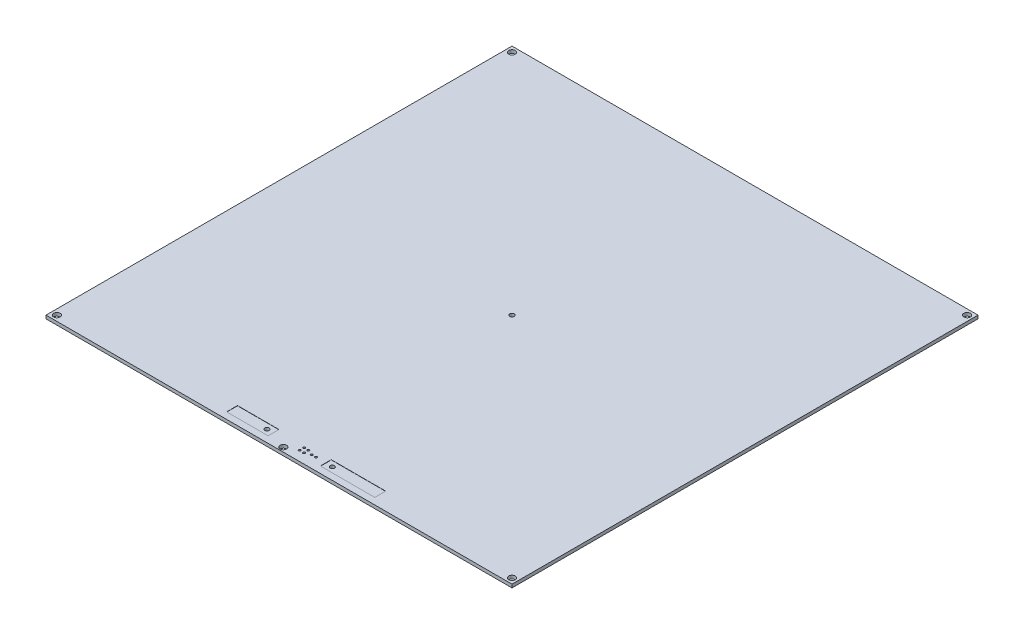
ISO-10303-21;
HEADER;
FILE_DESCRIPTION(('STEP AP214'),'2;1');
FILE_NAME('part.step','',(''),(''),'','','');
FILE_SCHEMA(('AUTOMOTIVE_DESIGN { 1 0 10303 214 1 1 1 1 }'));
ENDSEC;
DATA;
#1=APPLICATION_CONTEXT('core data for automotive mechanical design processes');
#2=APPLICATION_PROTOCOL_DEFINITION('international standard','automotive_design',2000,#1);
#3=PRODUCT_CONTEXT('',#1,'mechanical');
#4=PRODUCT('Part','Part','',(#3));
#5=PRODUCT_RELATED_PRODUCT_CATEGORY('part','',(#4));
#6=PRODUCT_DEFINITION_FORMATION('','',#4);
#7=PRODUCT_DEFINITION_CONTEXT('part definition',#1,'design');
#8=PRODUCT_DEFINITION('design','',#6,#7);
#9=PRODUCT_DEFINITION_SHAPE('','',#8);
#10=(LENGTH_UNIT() NAMED_UNIT(*) SI_UNIT(.MILLI.,.METRE.));
#11=(NAMED_UNIT(*) PLANE_ANGLE_UNIT() SI_UNIT($,.RADIAN.));
#12=(NAMED_UNIT(*) SI_UNIT($,.STERADIAN.) SOLID_ANGLE_UNIT());
#13=UNCERTAINTY_MEASURE_WITH_UNIT(LENGTH_MEASURE(1.E-05),#10,'distance_accuracy_value','');
#14=(GEOMETRIC_REPRESENTATION_CONTEXT(3) GLOBAL_UNCERTAINTY_ASSIGNED_CONTEXT((#13)) GLOBAL_UNIT_ASSIGNED_CONTEXT((#10,
#11,#12)) REPRESENTATION_CONTEXT('',''));
#15=CARTESIAN_POINT('',(0.,0.,0.));
#16=DIRECTION('',(0.,0.,1.));
#17=DIRECTION('',(1.,0.,0.));
#18=AXIS2_PLACEMENT_3D('',#15,#16,#17);
#19=CARTESIAN_POINT('',(19.,0.,101.5));
#20=DIRECTION('',(0.,1.,0.));
#21=DIRECTION('',(0.,0.,1.));
#22=AXIS2_PLACEMENT_3D('',#19,#20,#21);
#23=CYLINDRICAL_SURFACE('',#22,1.);
#24=CARTESIAN_POINT('',(19.,0.,101.5));
#25=DIRECTION('',(0.,1.,0.));
#26=DIRECTION('',(0.,0.,1.));
#27=AXIS2_PLACEMENT_3D('',#24,#25,#26);
#28=CIRCLE('',#27,1.);
#29=CARTESIAN_POINT('',(19.,0.,102.5));
#30=VERTEX_POINT('',#29);
#31=EDGE_CURVE('E234',#30,#30,#28,.T.);
#32=ORIENTED_EDGE('',*,*,#31,.F.);
#33=EDGE_LOOP('',(#32));
#34=FACE_BOUND('',#33,.T.);
#35=CARTESIAN_POINT('',(19.,1.4,101.5));
#36=DIRECTION('',(0.,1.,0.));
#37=DIRECTION('',(0.,0.,1.));
#38=AXIS2_PLACEMENT_3D('',#35,#36,#37);
#39=CIRCLE('',#38,1.);
#40=CARTESIAN_POINT('',(19.,1.4,102.5));
#41=VERTEX_POINT('',#40);
#42=EDGE_CURVE('E37',#41,#41,#39,.F.);
#43=ORIENTED_EDGE('',*,*,#42,.F.);
#44=EDGE_LOOP('',(#43));
#45=FACE_BOUND('',#44,.T.);
#46=ADVANCED_FACE('F33',(#34,#45),#23,.F.);
#47=CARTESIAN_POINT('',(-11.,0.,101.5));
#48=DIRECTION('',(0.,1.,0.));
#49=DIRECTION('',(0.,0.,1.));
#50=AXIS2_PLACEMENT_3D('',#47,#48,#49);
#51=CYLINDRICAL_SURFACE('',#50,1.);
#52=CARTESIAN_POINT('',(-11.,0.,101.5));
#53=DIRECTION('',(0.,1.,0.));
#54=DIRECTION('',(0.,0.,1.));
#55=AXIS2_PLACEMENT_3D('',#52,#53,#54);
#56=CIRCLE('',#55,1.);
#57=CARTESIAN_POINT('',(-11.,0.,102.5));
#58=VERTEX_POINT('',#57);
#59=EDGE_CURVE('E239',#58,#58,#56,.T.);
#60=ORIENTED_EDGE('',*,*,#59,.F.);
#61=EDGE_LOOP('',(#60));
#62=FACE_BOUND('',#61,.T.);
#63=CARTESIAN_POINT('',(-11.,1.4,101.5));
#64=DIRECTION('',(0.,1.,0.));
#65=DIRECTION('',(0.,0.,1.));
#66=AXIS2_PLACEMENT_3D('',#63,#64,#65);
#67=CIRCLE('',#66,1.);
#68=CARTESIAN_POINT('',(-11.,1.4,102.5));
#69=VERTEX_POINT('',#68);
#70=EDGE_CURVE('E188',#69,#69,#67,.F.);
#71=ORIENTED_EDGE('',*,*,#70,.F.);
#72=EDGE_LOOP('',(#71));
#73=FACE_BOUND('',#72,.T.);
#74=ADVANCED_FACE('F302',(#62,#73),#51,.F.);
#75=CARTESIAN_POINT('',(-107.,1.5,-107.));
#76=DIRECTION('',(1.,0.,0.));
#77=DIRECTION('',(0.,0.,-1.));
#78=AXIS2_PLACEMENT_3D('',#75,#76,#77);
#79=PLANE('',#78);
#80=DIRECTION('',(0.,0.,1.));
#81=VECTOR('',#80,1.);
#82=CARTESIAN_POINT('',(-107.,0.,-107.));
#83=LINE('',#82,#81);
#84=CARTESIAN_POINT('',(-107.,0.,-107.));
#85=VERTEX_POINT('',#84);
#86=CARTESIAN_POINT('',(-107.,0.,107.));
#87=VERTEX_POINT('',#86);
#88=EDGE_CURVE('E270',#85,#87,#83,.T.);
#89=ORIENTED_EDGE('',*,*,#88,.T.);
#90=DIRECTION('',(0.,-1.,0.));
#91=VECTOR('',#90,1.);
#92=CARTESIAN_POINT('',(-107.,1.5,107.));
#93=LINE('',#92,#91);
#94=CARTESIAN_POINT('',(-107.,1.5,107.));
#95=VERTEX_POINT('',#94);
#96=EDGE_CURVE('E11',#95,#87,#93,.T.);
#97=ORIENTED_EDGE('',*,*,#96,.F.);
#98=DIRECTION('',(0.,0.,1.));
#99=VECTOR('',#98,1.);
#100=CARTESIAN_POINT('',(-107.,1.5,-107.));
#101=LINE('',#100,#99);
#102=CARTESIAN_POINT('',(-107.,1.5,-107.));
#103=VERTEX_POINT('',#102);
#104=EDGE_CURVE('E273',#103,#95,#101,.T.);
#105=ORIENTED_EDGE('',*,*,#104,.F.);
#106=DIRECTION('',(0.,-1.,0.));
#107=VECTOR('',#106,1.);
#108=CARTESIAN_POINT('',(-107.,1.5,-107.));
#109=LINE('',#108,#107);
#110=EDGE_CURVE('E283',#103,#85,#109,.T.);
#111=ORIENTED_EDGE('',*,*,#110,.T.);
#112=EDGE_LOOP('',(#89,#97,#105,#111));
#113=FACE_BOUND('',#112,.T.);
#114=ADVANCED_FACE('F35',(#113),#79,.F.);
#115=CARTESIAN_POINT('',(107.,1.5,107.));
#116=DIRECTION('',(0.,0.,-1.));
#117=DIRECTION('',(-1.,0.,0.));
#118=AXIS2_PLACEMENT_3D('',#115,#116,#117);
#119=PLANE('',#118);
#120=DIRECTION('',(1.,0.,0.));
#121=VECTOR('',#120,1.);
#122=CARTESIAN_POINT('',(107.,0.,107.));
#123=LINE('',#122,#121);
#124=CARTESIAN_POINT('',(107.,0.,107.));
#125=VERTEX_POINT('',#124);
#126=EDGE_CURVE('E286',#87,#125,#123,.T.);
#127=ORIENTED_EDGE('',*,*,#126,.T.);
#128=DIRECTION('',(0.,-1.,0.));
#129=VECTOR('',#128,1.);
#130=CARTESIAN_POINT('',(107.,1.5,107.));
#131=LINE('',#130,#129);
#132=CARTESIAN_POINT('',(107.,1.5,107.));
#133=VERTEX_POINT('',#132);
#134=EDGE_CURVE('E42',#133,#125,#131,.T.);
#135=ORIENTED_EDGE('',*,*,#134,.F.);
#136=DIRECTION('',(1.,0.,0.));
#137=VECTOR('',#136,1.);
#138=CARTESIAN_POINT('',(107.,1.5,107.));
#139=LINE('',#138,#137);
#140=EDGE_CURVE('E276',#95,#133,#139,.T.);
#141=ORIENTED_EDGE('',*,*,#140,.F.);
#142=ORIENTED_EDGE('',*,*,#96,.T.);
#143=EDGE_LOOP('',(#127,#135,#141,#142));
#144=FACE_BOUND('',#143,.T.);
#145=ADVANCED_FACE('F310',(#144),#119,.F.);
#146=CARTESIAN_POINT('',(107.,1.5,-107.));
#147=DIRECTION('',(-1.,0.,0.));
#148=DIRECTION('',(0.,0.,1.));
#149=AXIS2_PLACEMENT_3D('',#146,#147,#148);
#150=PLANE('',#149);
#151=DIRECTION('',(0.,0.,-1.));
#152=VECTOR('',#151,1.);
#153=CARTESIAN_POINT('',(107.,0.,-107.));
#154=LINE('',#153,#152);
#155=CARTESIAN_POINT('',(107.,0.,-107.));
#156=VERTEX_POINT('',#155);
#157=EDGE_CURVE('E288',#125,#156,#154,.T.);
#158=ORIENTED_EDGE('',*,*,#157,.T.);
#159=DIRECTION('',(0.,-1.,0.));
#160=VECTOR('',#159,1.);
#161=CARTESIAN_POINT('',(107.,1.5,-107.));
#162=LINE('',#161,#160);
#163=CARTESIAN_POINT('',(107.,1.5,-107.));
#164=VERTEX_POINT('',#163);
#165=EDGE_CURVE('E293',#164,#156,#162,.T.);
#166=ORIENTED_EDGE('',*,*,#165,.F.);
#167=DIRECTION('',(0.,0.,-1.));
#168=VECTOR('',#167,1.);
#169=CARTESIAN_POINT('',(107.,1.5,-107.));
#170=LINE('',#169,#168);
#171=EDGE_CURVE('E279',#133,#164,#170,.T.);
#172=ORIENTED_EDGE('',*,*,#171,.F.);
#173=ORIENTED_EDGE('',*,*,#134,.T.);
#174=EDGE_LOOP('',(#158,#166,#172,#173));
#175=FACE_BOUND('',#174,.T.);
#176=ADVANCED_FACE('F349',(#175),#150,.F.);
#177=CARTESIAN_POINT('',(107.,1.5,-107.));
#178=DIRECTION('',(0.,0.,1.));
#179=DIRECTION('',(1.,0.,0.));
#180=AXIS2_PLACEMENT_3D('',#177,#178,#179);
#181=PLANE('',#180);
#182=DIRECTION('',(-1.,0.,0.));
#183=VECTOR('',#182,1.);
#184=CARTESIAN_POINT('',(107.,0.,-107.));
#185=LINE('',#184,#183);
#186=EDGE_CURVE('E277',#156,#85,#185,.T.);
#187=ORIENTED_EDGE('',*,*,#186,.T.);
#188=ORIENTED_EDGE('',*,*,#110,.F.);
#189=DIRECTION('',(-1.,0.,0.));
#190=VECTOR('',#189,1.);
#191=CARTESIAN_POINT('',(107.,1.5,-107.));
#192=LINE('',#191,#190);
#193=EDGE_CURVE('E281',#164,#103,#192,.T.);
#194=ORIENTED_EDGE('',*,*,#193,.F.);
#195=ORIENTED_EDGE('',*,*,#165,.T.);
#196=EDGE_LOOP('',(#187,#188,#194,#195));
#197=FACE_BOUND('',#196,.T.);
#198=ADVANCED_FACE('F342',(#197),#181,.F.);
#199=CARTESIAN_POINT('',(-107.,1.5,107.));
#200=DIRECTION('',(0.,-1.,0.));
#201=DIRECTION('',(0.,0.,-1.));
#202=AXIS2_PLACEMENT_3D('',#199,#200,#201);
#203=PLANE('',#202);
#204=DIRECTION('',(1.,0.,0.));
#205=VECTOR('',#204,1.);
#206=CARTESIAN_POINT('',(16.,1.5,104.));
#207=LINE('',#206,#205);
#208=CARTESIAN_POINT('',(16.,1.5,104.));
#209=VERTEX_POINT('',#208);
#210=CARTESIAN_POINT('',(41.,1.5,104.));
#211=VERTEX_POINT('',#210);
#212=EDGE_CURVE('E154',#209,#211,#207,.T.);
#213=ORIENTED_EDGE('',*,*,#212,.F.);
#214=DIRECTION('',(0.,0.,1.));
#215=VECTOR('',#214,1.);
#216=CARTESIAN_POINT('',(16.,1.5,99.));
#217=LINE('',#216,#215);
#218=CARTESIAN_POINT('',(16.,1.5,99.));
#219=VERTEX_POINT('',#218);
#220=EDGE_CURVE('E50',#219,#209,#217,.T.);
#221=ORIENTED_EDGE('',*,*,#220,.F.);
#222=DIRECTION('',(-1.,0.,0.));
#223=VECTOR('',#222,1.);
#224=CARTESIAN_POINT('',(16.,1.5,99.));
#225=LINE('',#224,#223);
#226=CARTESIAN_POINT('',(41.,1.5,99.));
#227=VERTEX_POINT('',#226);
#228=EDGE_CURVE('E145',#227,#219,#225,.T.);
#229=ORIENTED_EDGE('',*,*,#228,.F.);
#230=DIRECTION('',(0.,0.,-1.));
#231=VECTOR('',#230,1.);
#232=CARTESIAN_POINT('',(41.,1.5,99.));
#233=LINE('',#232,#231);
#234=EDGE_CURVE('E148',#211,#227,#233,.T.);
#235=ORIENTED_EDGE('',*,*,#234,.F.);
#236=EDGE_LOOP('',(#213,#221,#229,#235));
#237=FACE_BOUND('',#236,.T.);
#238=DIRECTION('',(1.,0.,0.));
#239=VECTOR('',#238,1.);
#240=CARTESIAN_POINT('',(-27.0506494979006,1.5,104.));
#241=LINE('',#240,#239);
#242=CARTESIAN_POINT('',(-27.0506494979006,1.5,104.));
#243=VERTEX_POINT('',#242);
#244=CARTESIAN_POINT('',(-8.,1.5,104.));
#245=VERTEX_POINT('',#244);
#246=EDGE_CURVE('E178',#243,#245,#241,.T.);
#247=ORIENTED_EDGE('',*,*,#246,.F.);
#248=DIRECTION('',(0.,0.,1.));
#249=VECTOR('',#248,1.);
#250=CARTESIAN_POINT('',(-27.0506494979006,1.5,99.));
#251=LINE('',#250,#249);
#252=CARTESIAN_POINT('',(-27.0506494979006,1.5,99.));
#253=VERTEX_POINT('',#252);
#254=EDGE_CURVE('E58',#253,#243,#251,.T.);
#255=ORIENTED_EDGE('',*,*,#254,.F.);
#256=DIRECTION('',(-1.,0.,0.));
#257=VECTOR('',#256,1.);
#258=CARTESIAN_POINT('',(-27.0506494979006,1.5,99.));
#259=LINE('',#258,#257);
#260=CARTESIAN_POINT('',(-8.,1.5,99.));
#261=VERTEX_POINT('',#260);
#262=EDGE_CURVE('E167',#261,#253,#259,.T.);
#263=ORIENTED_EDGE('',*,*,#262,.F.);
#264=DIRECTION('',(0.,0.,-1.));
#265=VECTOR('',#264,1.);
#266=CARTESIAN_POINT('',(-8.,1.5,99.));
#267=LINE('',#266,#265);
#268=EDGE_CURVE('E181',#245,#261,#267,.T.);
#269=ORIENTED_EDGE('',*,*,#268,.F.);
#270=EDGE_LOOP('',(#247,#255,#263,#269));
#271=FACE_BOUND('',#270,.T.);
#272=CARTESIAN_POINT('',(0.,1.5,0.));
#273=DIRECTION('',(0.,1.,0.));
#274=DIRECTION('',(0.,0.,1.));
#275=AXIS2_PLACEMENT_3D('',#272,#273,#274);
#276=CIRCLE('',#275,1.05);
#277=CARTESIAN_POINT('',(0.,1.5,1.05));
#278=VERTEX_POINT('',#277);
#279=EDGE_CURVE('E198',#278,#278,#276,.T.);
#280=ORIENTED_EDGE('',*,*,#279,.F.);
#281=EDGE_LOOP('',(#280));
#282=FACE_BOUND('',#281,.T.);
#283=CARTESIAN_POINT('',(11.5,1.5,101.5));
#284=DIRECTION('',(0.,1.,0.));
#285=DIRECTION('',(0.,0.,1.));
#286=AXIS2_PLACEMENT_3D('',#283,#284,#285);
#287=CIRCLE('',#286,0.500000000000001);
#288=CARTESIAN_POINT('',(11.5,1.5,102.));
#289=VERTEX_POINT('',#288);
#290=EDGE_CURVE('E197',#289,#289,#287,.T.);
#291=ORIENTED_EDGE('',*,*,#290,.F.);
#292=EDGE_LOOP('',(#291));
#293=FACE_BOUND('',#292,.T.);
#294=CARTESIAN_POINT('',(9.5,1.5,101.5));
#295=DIRECTION('',(0.,1.,0.));
#296=DIRECTION('',(0.,0.,1.));
#297=AXIS2_PLACEMENT_3D('',#294,#295,#296);
#298=CIRCLE('',#297,0.500000000000001);
#299=CARTESIAN_POINT('',(9.5,1.5,102.));
#300=VERTEX_POINT('',#299);
#301=EDGE_CURVE('E204',#300,#300,#298,.T.);
#302=ORIENTED_EDGE('',*,*,#301,.F.);
#303=EDGE_LOOP('',(#302));
#304=FACE_BOUND('',#303,.T.);
#305=CARTESIAN_POINT('',(7.,1.5,102.5));
#306=DIRECTION('',(0.,1.,0.));
#307=DIRECTION('',(0.,0.,1.));
#308=AXIS2_PLACEMENT_3D('',#305,#306,#307);
#309=CIRCLE('',#308,0.500000000000001);
#310=CARTESIAN_POINT('',(7.,1.5,103.));
#311=VERTEX_POINT('',#310);
#312=EDGE_CURVE('E210',#311,#311,#309,.T.);
#313=ORIENTED_EDGE('',*,*,#312,.F.);
#314=EDGE_LOOP('',(#313));
#315=FACE_BOUND('',#314,.T.);
#316=CARTESIAN_POINT('',(7.,1.5,100.5));
#317=DIRECTION('',(0.,1.,0.));
#318=DIRECTION('',(0.,0.,1.));
#319=AXIS2_PLACEMENT_3D('',#316,#317,#318);
#320=CIRCLE('',#319,0.500000000000001);
#321=CARTESIAN_POINT('',(7.,1.5,101.));
#322=VERTEX_POINT('',#321);
#323=EDGE_CURVE('E216',#322,#322,#320,.T.);
#324=ORIENTED_EDGE('',*,*,#323,.F.);
#325=EDGE_LOOP('',(#324));
#326=FACE_BOUND('',#325,.T.);
#327=CARTESIAN_POINT('',(5.,1.5,102.5));
#328=DIRECTION('',(0.,1.,0.));
#329=DIRECTION('',(0.,0.,1.));
#330=AXIS2_PLACEMENT_3D('',#327,#328,#329);
#331=CIRCLE('',#330,0.5);
#332=CARTESIAN_POINT('',(5.,1.5,103.));
#333=VERTEX_POINT('',#332);
#334=EDGE_CURVE('E222',#333,#333,#331,.T.);
#335=ORIENTED_EDGE('',*,*,#334,.F.);
#336=EDGE_LOOP('',(#335));
#337=FACE_BOUND('',#336,.T.);
#338=CARTESIAN_POINT('',(5.,1.5,100.5));
#339=DIRECTION('',(0.,1.,0.));
#340=DIRECTION('',(0.,0.,1.));
#341=AXIS2_PLACEMENT_3D('',#338,#339,#340);
#342=CIRCLE('',#341,0.500000000000001);
#343=CARTESIAN_POINT('',(5.,1.5,101.));
#344=VERTEX_POINT('',#343);
#345=EDGE_CURVE('E228',#344,#344,#342,.T.);
#346=ORIENTED_EDGE('',*,*,#345,.F.);
#347=EDGE_LOOP('',(#346));
#348=FACE_BOUND('',#347,.T.);
#349=CARTESIAN_POINT('',(0.,1.5,105.));
#350=DIRECTION('',(0.,1.,0.));
#351=DIRECTION('',(0.,0.,1.));
#352=AXIS2_PLACEMENT_3D('',#349,#350,#351);
#353=CIRCLE('',#352,1.5);
#354=CARTESIAN_POINT('',(0.,1.5,106.5));
#355=VERTEX_POINT('',#354);
#356=EDGE_CURVE('E242',#355,#355,#353,.T.);
#357=ORIENTED_EDGE('',*,*,#356,.F.);
#358=EDGE_LOOP('',(#357));
#359=FACE_BOUND('',#358,.T.);
#360=CARTESIAN_POINT('',(104.5,1.5,104.5));
#361=DIRECTION('',(0.,1.,0.));
#362=DIRECTION('',(0.,0.,-1.));
#363=AXIS2_PLACEMENT_3D('',#360,#361,#362);
#364=CIRCLE('',#363,1.5);
#365=CARTESIAN_POINT('',(104.5,1.5,103.));
#366=VERTEX_POINT('',#365);
#367=EDGE_CURVE('E246',#366,#366,#364,.T.);
#368=ORIENTED_EDGE('',*,*,#367,.F.);
#369=EDGE_LOOP('',(#368));
#370=FACE_BOUND('',#369,.T.);
#371=CARTESIAN_POINT('',(104.5,1.5,-104.5));
#372=DIRECTION('',(0.,-1.,0.));
#373=DIRECTION('',(0.,0.,1.));
#374=AXIS2_PLACEMENT_3D('',#371,#372,#373);
#375=CIRCLE('',#374,1.5);
#376=CARTESIAN_POINT('',(104.5,1.5,-103.));
#377=VERTEX_POINT('',#376);
#378=EDGE_CURVE('E252',#377,#377,#375,.T.);
#379=ORIENTED_EDGE('',*,*,#378,.T.);
#380=EDGE_LOOP('',(#379));
#381=FACE_BOUND('',#380,.T.);
#382=CARTESIAN_POINT('',(-104.5,1.5,104.5));
#383=DIRECTION('',(0.,-1.,0.));
#384=DIRECTION('',(0.,0.,-1.));
#385=AXIS2_PLACEMENT_3D('',#382,#383,#384);
#386=CIRCLE('',#385,1.5);
#387=CARTESIAN_POINT('',(-104.5,1.5,103.));
#388=VERTEX_POINT('',#387);
#389=EDGE_CURVE('E258',#388,#388,#386,.T.);
#390=ORIENTED_EDGE('',*,*,#389,.T.);
#391=EDGE_LOOP('',(#390));
#392=FACE_BOUND('',#391,.T.);
#393=CARTESIAN_POINT('',(-104.5,1.5,-104.5));
#394=DIRECTION('',(0.,1.,0.));
#395=DIRECTION('',(0.,0.,1.));
#396=AXIS2_PLACEMENT_3D('',#393,#394,#395);
#397=CIRCLE('',#396,1.5);
#398=CARTESIAN_POINT('',(-104.5,1.5,-103.));
#399=VERTEX_POINT('',#398);
#400=EDGE_CURVE('E264',#399,#399,#397,.T.);
#401=ORIENTED_EDGE('',*,*,#400,.F.);
#402=EDGE_LOOP('',(#401));
#403=FACE_BOUND('',#402,.T.);
#404=ORIENTED_EDGE('',*,*,#104,.T.);
#405=ORIENTED_EDGE('',*,*,#140,.T.);
#406=ORIENTED_EDGE('',*,*,#171,.T.);
#407=ORIENTED_EDGE('',*,*,#193,.T.);
#408=EDGE_LOOP('',(#404,#405,#406,#407));
#409=FACE_BOUND('',#408,.T.);
#410=ADVANCED_FACE('F339',(#237,#271,#282,#293,#304,#315,#326,#337,#348,#359,#370,#381,#392,
#403,#409),#203,.F.);
#411=CARTESIAN_POINT('',(-107.,0.,107.));
#412=DIRECTION('',(0.,-1.,0.));
#413=DIRECTION('',(0.,0.,-1.));
#414=AXIS2_PLACEMENT_3D('',#411,#412,#413);
#415=PLANE('',#414);
#416=CARTESIAN_POINT('',(0.,0.,0.));
#417=DIRECTION('',(0.,1.,0.));
#418=DIRECTION('',(0.,0.,1.));
#419=AXIS2_PLACEMENT_3D('',#416,#417,#418);
#420=CIRCLE('',#419,1.05);
#421=CARTESIAN_POINT('',(0.,0.,1.05));
#422=VERTEX_POINT('',#421);
#423=EDGE_CURVE('E194',#422,#422,#420,.T.);
#424=ORIENTED_EDGE('',*,*,#423,.T.);
#425=EDGE_LOOP('',(#424));
#426=FACE_BOUND('',#425,.T.);
#427=CARTESIAN_POINT('',(11.5,0.,101.5));
#428=DIRECTION('',(0.,1.,0.));
#429=DIRECTION('',(0.,0.,1.));
#430=AXIS2_PLACEMENT_3D('',#427,#428,#429);
#431=CIRCLE('',#430,0.500000000000001);
#432=CARTESIAN_POINT('',(11.5,0.,102.));
#433=VERTEX_POINT('',#432);
#434=EDGE_CURVE('E201',#433,#433,#431,.T.);
#435=ORIENTED_EDGE('',*,*,#434,.T.);
#436=EDGE_LOOP('',(#435));
#437=FACE_BOUND('',#436,.T.);
#438=CARTESIAN_POINT('',(9.5,0.,101.5));
#439=DIRECTION('',(0.,1.,0.));
#440=DIRECTION('',(0.,0.,1.));
#441=AXIS2_PLACEMENT_3D('',#438,#439,#440);
#442=CIRCLE('',#441,0.500000000000001);
#443=CARTESIAN_POINT('',(9.5,0.,102.));
#444=VERTEX_POINT('',#443);
#445=EDGE_CURVE('E207',#444,#444,#442,.T.);
#446=ORIENTED_EDGE('',*,*,#445,.T.);
#447=EDGE_LOOP('',(#446));
#448=FACE_BOUND('',#447,.T.);
#449=CARTESIAN_POINT('',(7.,0.,102.5));
#450=DIRECTION('',(0.,1.,0.));
#451=DIRECTION('',(0.,0.,1.));
#452=AXIS2_PLACEMENT_3D('',#449,#450,#451);
#453=CIRCLE('',#452,0.500000000000001);
#454=CARTESIAN_POINT('',(7.,0.,103.));
#455=VERTEX_POINT('',#454);
#456=EDGE_CURVE('E213',#455,#455,#453,.T.);
#457=ORIENTED_EDGE('',*,*,#456,.T.);
#458=EDGE_LOOP('',(#457));
#459=FACE_BOUND('',#458,.T.);
#460=CARTESIAN_POINT('',(7.,0.,100.5));
#461=DIRECTION('',(0.,1.,0.));
#462=DIRECTION('',(0.,0.,1.));
#463=AXIS2_PLACEMENT_3D('',#460,#461,#462);
#464=CIRCLE('',#463,0.500000000000001);
#465=CARTESIAN_POINT('',(7.,0.,101.));
#466=VERTEX_POINT('',#465);
#467=EDGE_CURVE('E219',#466,#466,#464,.T.);
#468=ORIENTED_EDGE('',*,*,#467,.T.);
#469=EDGE_LOOP('',(#468));
#470=FACE_BOUND('',#469,.T.);
#471=CARTESIAN_POINT('',(5.,0.,102.5));
#472=DIRECTION('',(0.,1.,0.));
#473=DIRECTION('',(0.,0.,1.));
#474=AXIS2_PLACEMENT_3D('',#471,#472,#473);
#475=CIRCLE('',#474,0.5);
#476=CARTESIAN_POINT('',(5.,0.,103.));
#477=VERTEX_POINT('',#476);
#478=EDGE_CURVE('E225',#477,#477,#475,.T.);
#479=ORIENTED_EDGE('',*,*,#478,.T.);
#480=EDGE_LOOP('',(#479));
#481=FACE_BOUND('',#480,.T.);
#482=CARTESIAN_POINT('',(5.,0.,100.5));
#483=DIRECTION('',(0.,1.,0.));
#484=DIRECTION('',(0.,0.,1.));
#485=AXIS2_PLACEMENT_3D('',#482,#483,#484);
#486=CIRCLE('',#485,0.500000000000001);
#487=CARTESIAN_POINT('',(5.,0.,101.));
#488=VERTEX_POINT('',#487);
#489=EDGE_CURVE('E231',#488,#488,#486,.T.);
#490=ORIENTED_EDGE('',*,*,#489,.T.);
#491=EDGE_LOOP('',(#490));
#492=FACE_BOUND('',#491,.T.);
#493=ORIENTED_EDGE('',*,*,#31,.T.);
#494=EDGE_LOOP('',(#493));
#495=FACE_BOUND('',#494,.T.);
#496=ORIENTED_EDGE('',*,*,#59,.T.);
#497=EDGE_LOOP('',(#496));
#498=FACE_BOUND('',#497,.T.);
#499=CARTESIAN_POINT('',(0.,0.,105.));
#500=DIRECTION('',(0.,1.,0.));
#501=DIRECTION('',(0.,0.,1.));
#502=AXIS2_PLACEMENT_3D('',#499,#500,#501);
#503=CIRCLE('',#502,1.5);
#504=CARTESIAN_POINT('',(0.,0.,106.5));
#505=VERTEX_POINT('',#504);
#506=EDGE_CURVE('E243',#505,#505,#503,.T.);
#507=ORIENTED_EDGE('',*,*,#506,.T.);
#508=EDGE_LOOP('',(#507));
#509=FACE_BOUND('',#508,.T.);
#510=CARTESIAN_POINT('',(104.5,0.,104.5));
#511=DIRECTION('',(0.,1.,0.));
#512=DIRECTION('',(0.,0.,-1.));
#513=AXIS2_PLACEMENT_3D('',#510,#511,#512);
#514=CIRCLE('',#513,1.5);
#515=CARTESIAN_POINT('',(104.5,0.,103.));
#516=VERTEX_POINT('',#515);
#517=EDGE_CURVE('E249',#516,#516,#514,.T.);
#518=ORIENTED_EDGE('',*,*,#517,.T.);
#519=EDGE_LOOP('',(#518));
#520=FACE_BOUND('',#519,.T.);
#521=CARTESIAN_POINT('',(104.5,0.,-104.5));
#522=DIRECTION('',(0.,-1.,0.));
#523=DIRECTION('',(0.,0.,1.));
#524=AXIS2_PLACEMENT_3D('',#521,#522,#523);
#525=CIRCLE('',#524,1.5);
#526=CARTESIAN_POINT('',(104.5,0.,-103.));
#527=VERTEX_POINT('',#526);
#528=EDGE_CURVE('E255',#527,#527,#525,.T.);
#529=ORIENTED_EDGE('',*,*,#528,.F.);
#530=EDGE_LOOP('',(#529));
#531=FACE_BOUND('',#530,.T.);
#532=CARTESIAN_POINT('',(-104.5,0.,104.5));
#533=DIRECTION('',(0.,-1.,0.));
#534=DIRECTION('',(0.,0.,-1.));
#535=AXIS2_PLACEMENT_3D('',#532,#533,#534);
#536=CIRCLE('',#535,1.5);
#537=CARTESIAN_POINT('',(-104.5,0.,103.));
#538=VERTEX_POINT('',#537);
#539=EDGE_CURVE('E261',#538,#538,#536,.T.);
#540=ORIENTED_EDGE('',*,*,#539,.F.);
#541=EDGE_LOOP('',(#540));
#542=FACE_BOUND('',#541,.T.);
#543=CARTESIAN_POINT('',(-104.5,0.,-104.5));
#544=DIRECTION('',(0.,1.,0.));
#545=DIRECTION('',(0.,0.,1.));
#546=AXIS2_PLACEMENT_3D('',#543,#544,#545);
#547=CIRCLE('',#546,1.5);
#548=CARTESIAN_POINT('',(-104.5,0.,-103.));
#549=VERTEX_POINT('',#548);
#550=EDGE_CURVE('E267',#549,#549,#547,.T.);
#551=ORIENTED_EDGE('',*,*,#550,.T.);
#552=EDGE_LOOP('',(#551));
#553=FACE_BOUND('',#552,.T.);
#554=ORIENTED_EDGE('',*,*,#88,.F.);
#555=ORIENTED_EDGE('',*,*,#186,.F.);
#556=ORIENTED_EDGE('',*,*,#157,.F.);
#557=ORIENTED_EDGE('',*,*,#126,.F.);
#558=EDGE_LOOP('',(#554,#555,#556,#557));
#559=FACE_BOUND('',#558,.T.);
#560=ADVANCED_FACE('F337',(#426,#437,#448,#459,#470,#481,#492,#495,#498,#509,#520,#531,#542,
#553,#559),#415,.T.);
#561=CARTESIAN_POINT('',(-104.5,0.,-104.5));
#562=DIRECTION('',(0.,1.,0.));
#563=DIRECTION('',(0.,0.,1.));
#564=AXIS2_PLACEMENT_3D('',#561,#562,#563);
#565=CYLINDRICAL_SURFACE('',#564,1.5);
#566=ORIENTED_EDGE('',*,*,#550,.F.);
#567=EDGE_LOOP('',(#566));
#568=FACE_BOUND('',#567,.T.);
#569=ORIENTED_EDGE('',*,*,#400,.T.);
#570=EDGE_LOOP('',(#569));
#571=FACE_BOUND('',#570,.T.);
#572=ADVANCED_FACE('F333',(#568,#571),#565,.F.);
#573=CARTESIAN_POINT('',(-104.5,0.,104.5));
#574=DIRECTION('',(0.,1.,0.));
#575=DIRECTION('',(0.,0.,1.));
#576=AXIS2_PLACEMENT_3D('',#573,#574,#575);
#577=CYLINDRICAL_SURFACE('',#576,1.5);
#578=ORIENTED_EDGE('',*,*,#539,.T.);
#579=EDGE_LOOP('',(#578));
#580=FACE_BOUND('',#579,.T.);
#581=ORIENTED_EDGE('',*,*,#389,.F.);
#582=EDGE_LOOP('',(#581));
#583=FACE_BOUND('',#582,.T.);
#584=ADVANCED_FACE('F329',(#580,#583),#577,.F.);
#585=CARTESIAN_POINT('',(104.5,0.,-104.5));
#586=DIRECTION('',(0.,1.,0.));
#587=DIRECTION('',(0.,0.,1.));
#588=AXIS2_PLACEMENT_3D('',#585,#586,#587);
#589=CYLINDRICAL_SURFACE('',#588,1.5);
#590=ORIENTED_EDGE('',*,*,#528,.T.);
#591=EDGE_LOOP('',(#590));
#592=FACE_BOUND('',#591,.T.);
#593=ORIENTED_EDGE('',*,*,#378,.F.);
#594=EDGE_LOOP('',(#593));
#595=FACE_BOUND('',#594,.T.);
#596=ADVANCED_FACE('F325',(#592,#595),#589,.F.);
#597=CARTESIAN_POINT('',(104.5,0.,104.5));
#598=DIRECTION('',(0.,1.,0.));
#599=DIRECTION('',(0.,0.,1.));
#600=AXIS2_PLACEMENT_3D('',#597,#598,#599);
#601=CYLINDRICAL_SURFACE('',#600,1.5);
#602=ORIENTED_EDGE('',*,*,#517,.F.);
#603=EDGE_LOOP('',(#602));
#604=FACE_BOUND('',#603,.T.);
#605=ORIENTED_EDGE('',*,*,#367,.T.);
#606=EDGE_LOOP('',(#605));
#607=FACE_BOUND('',#606,.T.);
#608=ADVANCED_FACE('F321',(#604,#607),#601,.F.);
#609=CARTESIAN_POINT('',(0.,0.,105.));
#610=DIRECTION('',(0.,1.,0.));
#611=DIRECTION('',(0.,0.,1.));
#612=AXIS2_PLACEMENT_3D('',#609,#610,#611);
#613=CYLINDRICAL_SURFACE('',#612,1.5);
#614=ORIENTED_EDGE('',*,*,#506,.F.);
#615=EDGE_LOOP('',(#614));
#616=FACE_BOUND('',#615,.T.);
#617=ORIENTED_EDGE('',*,*,#356,.T.);
#618=EDGE_LOOP('',(#617));
#619=FACE_BOUND('',#618,.T.);
#620=ADVANCED_FACE('F317',(#616,#619),#613,.F.);
#621=CARTESIAN_POINT('',(5.,0.,100.5));
#622=DIRECTION('',(0.,1.,0.));
#623=DIRECTION('',(0.,0.,1.));
#624=AXIS2_PLACEMENT_3D('',#621,#622,#623);
#625=CYLINDRICAL_SURFACE('',#624,0.500000000000001);
#626=ORIENTED_EDGE('',*,*,#489,.F.);
#627=EDGE_LOOP('',(#626));
#628=FACE_BOUND('',#627,.T.);
#629=ORIENTED_EDGE('',*,*,#345,.T.);
#630=EDGE_LOOP('',(#629));
#631=FACE_BOUND('',#630,.T.);
#632=ADVANCED_FACE('F320',(#628,#631),#625,.F.);
#633=CARTESIAN_POINT('',(5.,0.,102.5));
#634=DIRECTION('',(0.,1.,0.));
#635=DIRECTION('',(0.,0.,1.));
#636=AXIS2_PLACEMENT_3D('',#633,#634,#635);
#637=CYLINDRICAL_SURFACE('',#636,0.5);
#638=ORIENTED_EDGE('',*,*,#478,.F.);
#639=EDGE_LOOP('',(#638));
#640=FACE_BOUND('',#639,.T.);
#641=ORIENTED_EDGE('',*,*,#334,.T.);
#642=EDGE_LOOP('',(#641));
#643=FACE_BOUND('',#642,.T.);
#644=ADVANCED_FACE('F414',(#640,#643),#637,.F.);
#645=CARTESIAN_POINT('',(7.,0.,100.5));
#646=DIRECTION('',(0.,1.,0.));
#647=DIRECTION('',(0.,0.,1.));
#648=AXIS2_PLACEMENT_3D('',#645,#646,#647);
#649=CYLINDRICAL_SURFACE('',#648,0.500000000000001);
#650=ORIENTED_EDGE('',*,*,#467,.F.);
#651=EDGE_LOOP('',(#650));
#652=FACE_BOUND('',#651,.T.);
#653=ORIENTED_EDGE('',*,*,#323,.T.);
#654=EDGE_LOOP('',(#653));
#655=FACE_BOUND('',#654,.T.);
#656=ADVANCED_FACE('F421',(#652,#655),#649,.F.);
#657=CARTESIAN_POINT('',(7.,0.,102.5));
#658=DIRECTION('',(0.,1.,0.));
#659=DIRECTION('',(0.,0.,1.));
#660=AXIS2_PLACEMENT_3D('',#657,#658,#659);
#661=CYLINDRICAL_SURFACE('',#660,0.500000000000001);
#662=ORIENTED_EDGE('',*,*,#456,.F.);
#663=EDGE_LOOP('',(#662));
#664=FACE_BOUND('',#663,.T.);
#665=ORIENTED_EDGE('',*,*,#312,.T.);
#666=EDGE_LOOP('',(#665));
#667=FACE_BOUND('',#666,.T.);
#668=ADVANCED_FACE('F429',(#664,#667),#661,.F.);
#669=CARTESIAN_POINT('',(9.5,0.,101.5));
#670=DIRECTION('',(0.,1.,0.));
#671=DIRECTION('',(0.,0.,1.));
#672=AXIS2_PLACEMENT_3D('',#669,#670,#671);
#673=CYLINDRICAL_SURFACE('',#672,0.500000000000001);
#674=ORIENTED_EDGE('',*,*,#445,.F.);
#675=EDGE_LOOP('',(#674));
#676=FACE_BOUND('',#675,.T.);
#677=ORIENTED_EDGE('',*,*,#301,.T.);
#678=EDGE_LOOP('',(#677));
#679=FACE_BOUND('',#678,.T.);
#680=ADVANCED_FACE('F437',(#676,#679),#673,.F.);
#681=CARTESIAN_POINT('',(11.5,0.,101.5));
#682=DIRECTION('',(0.,1.,0.));
#683=DIRECTION('',(0.,0.,1.));
#684=AXIS2_PLACEMENT_3D('',#681,#682,#683);
#685=CYLINDRICAL_SURFACE('',#684,0.500000000000001);
#686=ORIENTED_EDGE('',*,*,#434,.F.);
#687=EDGE_LOOP('',(#686));
#688=FACE_BOUND('',#687,.T.);
#689=ORIENTED_EDGE('',*,*,#290,.T.);
#690=EDGE_LOOP('',(#689));
#691=FACE_BOUND('',#690,.T.);
#692=ADVANCED_FACE('F445',(#688,#691),#685,.F.);
#693=CARTESIAN_POINT('',(0.,0.,0.));
#694=DIRECTION('',(0.,1.,0.));
#695=DIRECTION('',(0.,0.,1.));
#696=AXIS2_PLACEMENT_3D('',#693,#694,#695);
#697=CYLINDRICAL_SURFACE('',#696,1.05);
#698=ORIENTED_EDGE('',*,*,#423,.F.);
#699=EDGE_LOOP('',(#698));
#700=FACE_BOUND('',#699,.T.);
#701=ORIENTED_EDGE('',*,*,#279,.T.);
#702=EDGE_LOOP('',(#701));
#703=FACE_BOUND('',#702,.T.);
#704=ADVANCED_FACE('F453',(#700,#703),#697,.F.);
#705=CARTESIAN_POINT('',(-27.0506494979006,1.4,104.));
#706=DIRECTION('',(0.,1.,0.));
#707=DIRECTION('',(0.,0.,1.));
#708=AXIS2_PLACEMENT_3D('',#705,#706,#707);
#709=PLANE('',#708);
#710=DIRECTION('',(0.,0.,1.));
#711=VECTOR('',#710,1.);
#712=CARTESIAN_POINT('',(-27.0506494979006,1.4,99.));
#713=LINE('',#712,#711);
#714=CARTESIAN_POINT('',(-27.0506494979006,1.4,99.));
#715=VERTEX_POINT('',#714);
#716=CARTESIAN_POINT('',(-27.0506494979006,1.4,104.));
#717=VERTEX_POINT('',#716);
#718=EDGE_CURVE('E163',#715,#717,#713,.T.);
#719=ORIENTED_EDGE('',*,*,#718,.T.);
#720=DIRECTION('',(1.,0.,0.));
#721=VECTOR('',#720,1.);
#722=CARTESIAN_POINT('',(-27.0506494979006,1.4,104.));
#723=LINE('',#722,#721);
#724=CARTESIAN_POINT('',(-8.,1.4,104.));
#725=VERTEX_POINT('',#724);
#726=EDGE_CURVE('E166',#717,#725,#723,.T.);
#727=ORIENTED_EDGE('',*,*,#726,.T.);
#728=DIRECTION('',(0.,0.,-1.));
#729=VECTOR('',#728,1.);
#730=CARTESIAN_POINT('',(-8.,1.4,99.));
#731=LINE('',#730,#729);
#732=CARTESIAN_POINT('',(-8.,1.4,99.));
#733=VERTEX_POINT('',#732);
#734=EDGE_CURVE('E170',#725,#733,#731,.T.);
#735=ORIENTED_EDGE('',*,*,#734,.T.);
#736=DIRECTION('',(-1.,0.,0.));
#737=VECTOR('',#736,1.);
#738=CARTESIAN_POINT('',(-27.0506494979006,1.4,99.));
#739=LINE('',#738,#737);
#740=EDGE_CURVE('E173',#733,#715,#739,.T.);
#741=ORIENTED_EDGE('',*,*,#740,.T.);
#742=EDGE_LOOP('',(#719,#727,#735,#741));
#743=FACE_BOUND('',#742,.T.);
#744=ORIENTED_EDGE('',*,*,#70,.T.);
#745=EDGE_LOOP('',(#744));
#746=FACE_BOUND('',#745,.T.);
#747=ADVANCED_FACE('F300',(#743,#746),#709,.T.);
#748=CARTESIAN_POINT('',(-27.0506494979006,1.4,99.));
#749=DIRECTION('',(-1.,0.,0.));
#750=DIRECTION('',(0.,0.,1.));
#751=AXIS2_PLACEMENT_3D('',#748,#749,#750);
#752=PLANE('',#751);
#753=ORIENTED_EDGE('',*,*,#254,.T.);
#754=DIRECTION('',(0.,1.,0.));
#755=VECTOR('',#754,1.);
#756=CARTESIAN_POINT('',(-27.0506494979006,1.4,104.));
#757=LINE('',#756,#755);
#758=EDGE_CURVE('E176',#717,#243,#757,.T.);
#759=ORIENTED_EDGE('',*,*,#758,.F.);
#760=ORIENTED_EDGE('',*,*,#718,.F.);
#761=DIRECTION('',(0.,1.,0.));
#762=VECTOR('',#761,1.);
#763=CARTESIAN_POINT('',(-27.0506494979006,1.4,99.));
#764=LINE('',#763,#762);
#765=EDGE_CURVE('E186',#715,#253,#764,.T.);
#766=ORIENTED_EDGE('',*,*,#765,.T.);
#767=EDGE_LOOP('',(#753,#759,#760,#766));
#768=FACE_BOUND('',#767,.T.);
#769=ADVANCED_FACE('F468',(#768),#752,.F.);
#770=CARTESIAN_POINT('',(-27.0506494979006,1.4,99.));
#771=DIRECTION('',(0.,0.,-1.));
#772=DIRECTION('',(-1.,0.,0.));
#773=AXIS2_PLACEMENT_3D('',#770,#771,#772);
#774=PLANE('',#773);
#775=ORIENTED_EDGE('',*,*,#262,.T.);
#776=ORIENTED_EDGE('',*,*,#765,.F.);
#777=ORIENTED_EDGE('',*,*,#740,.F.);
#778=DIRECTION('',(0.,1.,0.));
#779=VECTOR('',#778,1.);
#780=CARTESIAN_POINT('',(-8.,1.4,99.));
#781=LINE('',#780,#779);
#782=EDGE_CURVE('E189',#733,#261,#781,.T.);
#783=ORIENTED_EDGE('',*,*,#782,.T.);
#784=EDGE_LOOP('',(#775,#776,#777,#783));
#785=FACE_BOUND('',#784,.T.);
#786=ADVANCED_FACE('F476',(#785),#774,.F.);
#787=CARTESIAN_POINT('',(-8.,1.4,99.));
#788=DIRECTION('',(1.,0.,0.));
#789=DIRECTION('',(0.,0.,-1.));
#790=AXIS2_PLACEMENT_3D('',#787,#788,#789);
#791=PLANE('',#790);
#792=ORIENTED_EDGE('',*,*,#268,.T.);
#793=ORIENTED_EDGE('',*,*,#782,.F.);
#794=ORIENTED_EDGE('',*,*,#734,.F.);
#795=DIRECTION('',(0.,1.,0.));
#796=VECTOR('',#795,1.);
#797=CARTESIAN_POINT('',(-8.,1.4,104.));
#798=LINE('',#797,#796);
#799=EDGE_CURVE('E191',#725,#245,#798,.T.);
#800=ORIENTED_EDGE('',*,*,#799,.T.);
#801=EDGE_LOOP('',(#792,#793,#794,#800));
#802=FACE_BOUND('',#801,.T.);
#803=ADVANCED_FACE('F483',(#802),#791,.F.);
#804=CARTESIAN_POINT('',(-27.0506494979006,1.4,104.));
#805=DIRECTION('',(0.,0.,1.));
#806=DIRECTION('',(1.,0.,0.));
#807=AXIS2_PLACEMENT_3D('',#804,#805,#806);
#808=PLANE('',#807);
#809=ORIENTED_EDGE('',*,*,#246,.T.);
#810=ORIENTED_EDGE('',*,*,#799,.F.);
#811=ORIENTED_EDGE('',*,*,#726,.F.);
#812=ORIENTED_EDGE('',*,*,#758,.T.);
#813=EDGE_LOOP('',(#809,#810,#811,#812));
#814=FACE_BOUND('',#813,.T.);
#815=ADVANCED_FACE('F491',(#814),#808,.F.);
#816=CARTESIAN_POINT('',(16.,1.4,104.));
#817=DIRECTION('',(0.,1.,0.));
#818=DIRECTION('',(0.,0.,1.));
#819=AXIS2_PLACEMENT_3D('',#816,#817,#818);
#820=PLANE('',#819);
#821=DIRECTION('',(0.,0.,1.));
#822=VECTOR('',#821,1.);
#823=CARTESIAN_POINT('',(16.,1.4,99.));
#824=LINE('',#823,#822);
#825=CARTESIAN_POINT('',(16.,1.4,99.));
#826=VERTEX_POINT('',#825);
#827=CARTESIAN_POINT('',(16.,1.4,104.));
#828=VERTEX_POINT('',#827);
#829=EDGE_CURVE('E126',#826,#828,#824,.T.);
#830=ORIENTED_EDGE('',*,*,#829,.T.);
#831=DIRECTION('',(1.,0.,0.));
#832=VECTOR('',#831,1.);
#833=CARTESIAN_POINT('',(16.,1.4,104.));
#834=LINE('',#833,#832);
#835=CARTESIAN_POINT('',(41.,1.4,104.));
#836=VERTEX_POINT('',#835);
#837=EDGE_CURVE('E135',#828,#836,#834,.T.);
#838=ORIENTED_EDGE('',*,*,#837,.T.);
#839=DIRECTION('',(0.,0.,-1.));
#840=VECTOR('',#839,1.);
#841=CARTESIAN_POINT('',(41.,1.4,99.));
#842=LINE('',#841,#840);
#843=CARTESIAN_POINT('',(41.,1.4,99.));
#844=VERTEX_POINT('',#843);
#845=EDGE_CURVE('E140',#836,#844,#842,.T.);
#846=ORIENTED_EDGE('',*,*,#845,.T.);
#847=DIRECTION('',(-1.,0.,0.));
#848=VECTOR('',#847,1.);
#849=CARTESIAN_POINT('',(16.,1.4,99.));
#850=LINE('',#849,#848);
#851=EDGE_CURVE('E132',#844,#826,#850,.T.);
#852=ORIENTED_EDGE('',*,*,#851,.T.);
#853=EDGE_LOOP('',(#830,#838,#846,#852));
#854=FACE_BOUND('',#853,.T.);
#855=ORIENTED_EDGE('',*,*,#42,.T.);
#856=EDGE_LOOP('',(#855));
#857=FACE_BOUND('',#856,.T.);
#858=ADVANCED_FACE('F142',(#854,#857),#820,.T.);
#859=CARTESIAN_POINT('',(16.,1.4,99.));
#860=DIRECTION('',(-1.,0.,0.));
#861=DIRECTION('',(0.,0.,1.));
#862=AXIS2_PLACEMENT_3D('',#859,#860,#861);
#863=PLANE('',#862);
#864=ORIENTED_EDGE('',*,*,#220,.T.);
#865=DIRECTION('',(0.,1.,0.));
#866=VECTOR('',#865,1.);
#867=CARTESIAN_POINT('',(16.,1.4,104.));
#868=LINE('',#867,#866);
#869=EDGE_CURVE('E122',#828,#209,#868,.T.);
#870=ORIENTED_EDGE('',*,*,#869,.F.);
#871=ORIENTED_EDGE('',*,*,#829,.F.);
#872=DIRECTION('',(0.,1.,0.));
#873=VECTOR('',#872,1.);
#874=CARTESIAN_POINT('',(16.,1.4,99.));
#875=LINE('',#874,#873);
#876=EDGE_CURVE('E158',#826,#219,#875,.T.);
#877=ORIENTED_EDGE('',*,*,#876,.T.);
#878=EDGE_LOOP('',(#864,#870,#871,#877));
#879=FACE_BOUND('',#878,.T.);
#880=ADVANCED_FACE('F124',(#879),#863,.F.);
#881=CARTESIAN_POINT('',(16.,1.4,99.));
#882=DIRECTION('',(0.,0.,-1.));
#883=DIRECTION('',(-1.,0.,0.));
#884=AXIS2_PLACEMENT_3D('',#881,#882,#883);
#885=PLANE('',#884);
#886=ORIENTED_EDGE('',*,*,#228,.T.);
#887=ORIENTED_EDGE('',*,*,#876,.F.);
#888=ORIENTED_EDGE('',*,*,#851,.F.);
#889=DIRECTION('',(0.,1.,0.));
#890=VECTOR('',#889,1.);
#891=CARTESIAN_POINT('',(41.,1.4,99.));
#892=LINE('',#891,#890);
#893=EDGE_CURVE('E160',#844,#227,#892,.T.);
#894=ORIENTED_EDGE('',*,*,#893,.T.);
#895=EDGE_LOOP('',(#886,#887,#888,#894));
#896=FACE_BOUND('',#895,.T.);
#897=ADVANCED_FACE('F512',(#896),#885,.F.);
#898=CARTESIAN_POINT('',(41.,1.4,99.));
#899=DIRECTION('',(1.,0.,0.));
#900=DIRECTION('',(0.,0.,-1.));
#901=AXIS2_PLACEMENT_3D('',#898,#899,#900);
#902=PLANE('',#901);
#903=ORIENTED_EDGE('',*,*,#234,.T.);
#904=ORIENTED_EDGE('',*,*,#893,.F.);
#905=ORIENTED_EDGE('',*,*,#845,.F.);
#906=DIRECTION('',(0.,1.,0.));
#907=VECTOR('',#906,1.);
#908=CARTESIAN_POINT('',(41.,1.4,104.));
#909=LINE('',#908,#907);
#910=EDGE_CURVE('E131',#836,#211,#909,.T.);
#911=ORIENTED_EDGE('',*,*,#910,.T.);
#912=EDGE_LOOP('',(#903,#904,#905,#911));
#913=FACE_BOUND('',#912,.T.);
#914=ADVANCED_FACE('F519',(#913),#902,.F.);
#915=CARTESIAN_POINT('',(16.,1.4,104.));
#916=DIRECTION('',(0.,0.,1.));
#917=DIRECTION('',(1.,0.,0.));
#918=AXIS2_PLACEMENT_3D('',#915,#916,#917);
#919=PLANE('',#918);
#920=ORIENTED_EDGE('',*,*,#212,.T.);
#921=ORIENTED_EDGE('',*,*,#910,.F.);
#922=ORIENTED_EDGE('',*,*,#837,.F.);
#923=ORIENTED_EDGE('',*,*,#869,.T.);
#924=EDGE_LOOP('',(#920,#921,#922,#923));
#925=FACE_BOUND('',#924,.T.);
#926=ADVANCED_FACE('F136',(#925),#919,.F.);
#927=CLOSED_SHELL('',(#46,#74,#114,#145,#176,#198,#410,#560,#572,#584,#596,#608,#620,#632,#644,
#656,#668,#680,#692,#704,#747,#769,#786,#803,#815,#858,#880,#897,#914,#926));
#928=MANIFOLD_SOLID_BREP('B2',#927);
#929=ADVANCED_BREP_SHAPE_REPRESENTATION('',(#18,#928),#14);
#930=SHAPE_DEFINITION_REPRESENTATION(#9,#929);
ENDSEC;
END-ISO-10303-21;
